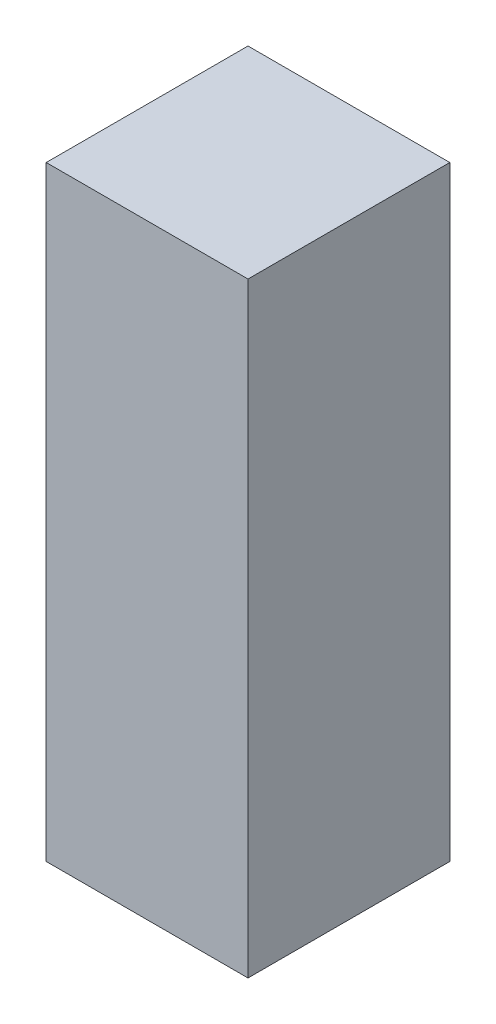
ISO-10303-21;
HEADER;
FILE_DESCRIPTION(('STEP AP214'),'2;1');
FILE_NAME('part.step','',(''),(''),'','','');
FILE_SCHEMA(('AUTOMOTIVE_DESIGN { 1 0 10303 214 1 1 1 1 }'));
ENDSEC;
DATA;
#1=APPLICATION_CONTEXT('core data for automotive mechanical design processes');
#2=APPLICATION_PROTOCOL_DEFINITION('international standard','automotive_design',2000,#1);
#3=PRODUCT_CONTEXT('',#1,'mechanical');
#4=PRODUCT('Part','Part','',(#3));
#5=PRODUCT_RELATED_PRODUCT_CATEGORY('part','',(#4));
#6=PRODUCT_DEFINITION_FORMATION('','',#4);
#7=PRODUCT_DEFINITION_CONTEXT('part definition',#1,'design');
#8=PRODUCT_DEFINITION('design','',#6,#7);
#9=PRODUCT_DEFINITION_SHAPE('','',#8);
#10=(LENGTH_UNIT() NAMED_UNIT(*) SI_UNIT(.MILLI.,.METRE.));
#11=(NAMED_UNIT(*) PLANE_ANGLE_UNIT() SI_UNIT($,.RADIAN.));
#12=(NAMED_UNIT(*) SI_UNIT($,.STERADIAN.) SOLID_ANGLE_UNIT());
#13=UNCERTAINTY_MEASURE_WITH_UNIT(LENGTH_MEASURE(1.E-05),#10,'distance_accuracy_value','');
#14=(GEOMETRIC_REPRESENTATION_CONTEXT(3) GLOBAL_UNCERTAINTY_ASSIGNED_CONTEXT((#13)) GLOBAL_UNIT_ASSIGNED_CONTEXT((#10,
#11,#12)) REPRESENTATION_CONTEXT('',''));
#15=CARTESIAN_POINT('',(0.,0.,0.));
#16=DIRECTION('',(0.,0.,1.));
#17=DIRECTION('',(1.,0.,0.));
#18=AXIS2_PLACEMENT_3D('',#15,#16,#17);
#19=CARTESIAN_POINT('',(2.5,-7.5,5.));
#20=DIRECTION('',(-1.,0.,0.));
#21=DIRECTION('',(0.,0.,1.));
#22=AXIS2_PLACEMENT_3D('',#19,#20,#21);
#23=PLANE('',#22);
#24=DIRECTION('',(0.,1.,0.));
#25=VECTOR('',#24,1.);
#26=CARTESIAN_POINT('',(2.5,-7.5,0.));
#27=LINE('',#26,#25);
#28=CARTESIAN_POINT('',(2.5,-7.5,0.));
#29=VERTEX_POINT('',#28);
#30=CARTESIAN_POINT('',(2.5,7.5,0.));
#31=VERTEX_POINT('',#30);
#32=EDGE_CURVE('E101',#29,#31,#27,.T.);
#33=ORIENTED_EDGE('',*,*,#32,.T.);
#34=DIRECTION('',(0.,0.,-1.));
#35=VECTOR('',#34,1.);
#36=CARTESIAN_POINT('',(2.5,7.5,5.));
#37=LINE('',#36,#35);
#38=CARTESIAN_POINT('',(2.5,7.5,5.));
#39=VERTEX_POINT('',#38);
#40=EDGE_CURVE('E11',#39,#31,#37,.T.);
#41=ORIENTED_EDGE('',*,*,#40,.F.);
#42=DIRECTION('',(0.,1.,0.));
#43=VECTOR('',#42,1.);
#44=CARTESIAN_POINT('',(2.5,-7.5,5.));
#45=LINE('',#44,#43);
#46=CARTESIAN_POINT('',(2.5,-7.5,5.));
#47=VERTEX_POINT('',#46);
#48=EDGE_CURVE('E89',#47,#39,#45,.T.);
#49=ORIENTED_EDGE('',*,*,#48,.F.);
#50=DIRECTION('',(0.,0.,-1.));
#51=VECTOR('',#50,1.);
#52=CARTESIAN_POINT('',(2.5,-7.5,5.));
#53=LINE('',#52,#51);
#54=EDGE_CURVE('E97',#47,#29,#53,.T.);
#55=ORIENTED_EDGE('',*,*,#54,.T.);
#56=EDGE_LOOP('',(#33,#41,#49,#55));
#57=FACE_BOUND('',#56,.T.);
#58=ADVANCED_FACE('F38',(#57),#23,.F.);
#59=CARTESIAN_POINT('',(-2.5,7.5,5.));
#60=DIRECTION('',(0.,-1.,0.));
#61=DIRECTION('',(0.,0.,-1.));
#62=AXIS2_PLACEMENT_3D('',#59,#60,#61);
#63=PLANE('',#62);
#64=DIRECTION('',(-1.,0.,0.));
#65=VECTOR('',#64,1.);
#66=CARTESIAN_POINT('',(-2.5,7.5,0.));
#67=LINE('',#66,#65);
#68=CARTESIAN_POINT('',(-2.5,7.5,0.));
#69=VERTEX_POINT('',#68);
#70=EDGE_CURVE('E93',#31,#69,#67,.T.);
#71=ORIENTED_EDGE('',*,*,#70,.T.);
#72=DIRECTION('',(0.,0.,-1.));
#73=VECTOR('',#72,1.);
#74=CARTESIAN_POINT('',(-2.5,7.5,5.));
#75=LINE('',#74,#73);
#76=CARTESIAN_POINT('',(-2.5,7.5,5.));
#77=VERTEX_POINT('',#76);
#78=EDGE_CURVE('E46',#77,#69,#75,.T.);
#79=ORIENTED_EDGE('',*,*,#78,.F.);
#80=DIRECTION('',(-1.,0.,0.));
#81=VECTOR('',#80,1.);
#82=CARTESIAN_POINT('',(-2.5,7.5,5.));
#83=LINE('',#82,#81);
#84=EDGE_CURVE('E84',#39,#77,#83,.T.);
#85=ORIENTED_EDGE('',*,*,#84,.F.);
#86=ORIENTED_EDGE('',*,*,#40,.T.);
#87=EDGE_LOOP('',(#71,#79,#85,#86));
#88=FACE_BOUND('',#87,.T.);
#89=ADVANCED_FACE('F92',(#88),#63,.F.);
#90=CARTESIAN_POINT('',(-2.5,-7.5,5.));
#91=DIRECTION('',(1.,0.,0.));
#92=DIRECTION('',(0.,0.,-1.));
#93=AXIS2_PLACEMENT_3D('',#90,#91,#92);
#94=PLANE('',#93);
#95=DIRECTION('',(0.,-1.,0.));
#96=VECTOR('',#95,1.);
#97=CARTESIAN_POINT('',(-2.5,-7.5,0.));
#98=LINE('',#97,#96);
#99=CARTESIAN_POINT('',(-2.5,-7.5,0.));
#100=VERTEX_POINT('',#99);
#101=EDGE_CURVE('E71',#69,#100,#98,.T.);
#102=ORIENTED_EDGE('',*,*,#101,.T.);
#103=DIRECTION('',(0.,0.,-1.));
#104=VECTOR('',#103,1.);
#105=CARTESIAN_POINT('',(-2.5,-7.5,5.));
#106=LINE('',#105,#104);
#107=CARTESIAN_POINT('',(-2.5,-7.5,5.));
#108=VERTEX_POINT('',#107);
#109=EDGE_CURVE('E94',#108,#100,#106,.T.);
#110=ORIENTED_EDGE('',*,*,#109,.F.);
#111=DIRECTION('',(0.,-1.,0.));
#112=VECTOR('',#111,1.);
#113=CARTESIAN_POINT('',(-2.5,-7.5,5.));
#114=LINE('',#113,#112);
#115=EDGE_CURVE('E87',#77,#108,#114,.T.);
#116=ORIENTED_EDGE('',*,*,#115,.F.);
#117=ORIENTED_EDGE('',*,*,#78,.T.);
#118=EDGE_LOOP('',(#102,#110,#116,#117));
#119=FACE_BOUND('',#118,.T.);
#120=ADVANCED_FACE('F95',(#119),#94,.F.);
#121=CARTESIAN_POINT('',(-2.5,-7.5,5.));
#122=DIRECTION('',(0.,1.,0.));
#123=DIRECTION('',(0.,0.,1.));
#124=AXIS2_PLACEMENT_3D('',#121,#122,#123);
#125=PLANE('',#124);
#126=DIRECTION('',(1.,0.,0.));
#127=VECTOR('',#126,1.);
#128=CARTESIAN_POINT('',(-2.5,-7.5,0.));
#129=LINE('',#128,#127);
#130=EDGE_CURVE('E77',#100,#29,#129,.T.);
#131=ORIENTED_EDGE('',*,*,#130,.T.);
#132=ORIENTED_EDGE('',*,*,#54,.F.);
#133=DIRECTION('',(1.,0.,0.));
#134=VECTOR('',#133,1.);
#135=CARTESIAN_POINT('',(-2.5,-7.5,5.));
#136=LINE('',#135,#134);
#137=EDGE_CURVE('E54',#108,#47,#136,.T.);
#138=ORIENTED_EDGE('',*,*,#137,.F.);
#139=ORIENTED_EDGE('',*,*,#109,.T.);
#140=EDGE_LOOP('',(#131,#132,#138,#139));
#141=FACE_BOUND('',#140,.T.);
#142=ADVANCED_FACE('F108',(#141),#125,.F.);
#143=CARTESIAN_POINT('',(0.,0.,5.));
#144=DIRECTION('',(0.,0.,-1.));
#145=DIRECTION('',(-1.,0.,0.));
#146=AXIS2_PLACEMENT_3D('',#143,#144,#145);
#147=PLANE('',#146);
#148=ORIENTED_EDGE('',*,*,#48,.T.);
#149=ORIENTED_EDGE('',*,*,#84,.T.);
#150=ORIENTED_EDGE('',*,*,#115,.T.);
#151=ORIENTED_EDGE('',*,*,#137,.T.);
#152=EDGE_LOOP('',(#148,#149,#150,#151));
#153=FACE_BOUND('',#152,.T.);
#154=ADVANCED_FACE('F85',(#153),#147,.F.);
#155=CARTESIAN_POINT('',(0.,0.,0.));
#156=DIRECTION('',(0.,0.,-1.));
#157=DIRECTION('',(-1.,0.,0.));
#158=AXIS2_PLACEMENT_3D('',#155,#156,#157);
#159=PLANE('',#158);
#160=ORIENTED_EDGE('',*,*,#32,.F.);
#161=ORIENTED_EDGE('',*,*,#130,.F.);
#162=ORIENTED_EDGE('',*,*,#101,.F.);
#163=ORIENTED_EDGE('',*,*,#70,.F.);
#164=EDGE_LOOP('',(#160,#161,#162,#163));
#165=FACE_BOUND('',#164,.T.);
#166=ADVANCED_FACE('F111',(#165),#159,.T.);
#167=CLOSED_SHELL('',(#58,#89,#120,#142,#154,#166));
#168=MANIFOLD_SOLID_BREP('B2',#167);
#169=ADVANCED_BREP_SHAPE_REPRESENTATION('',(#18,#168),#14);
#170=SHAPE_DEFINITION_REPRESENTATION(#9,#169);
ENDSEC;
END-ISO-10303-21;
